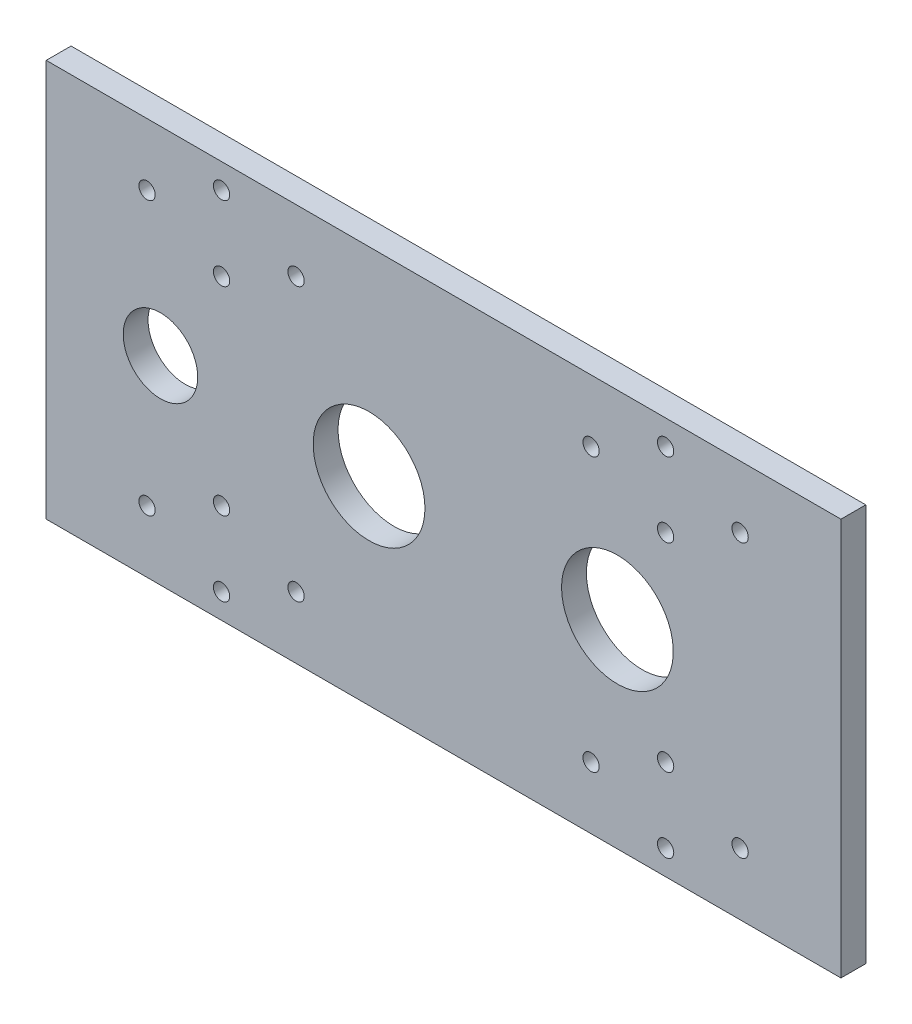
ISO-10303-21;
HEADER;
FILE_DESCRIPTION(('STEP AP214'),'2;1');
FILE_NAME('part.step','',(''),(''),'','','');
FILE_SCHEMA(('AUTOMOTIVE_DESIGN { 1 0 10303 214 1 1 1 1 }'));
ENDSEC;
DATA;
#1=APPLICATION_CONTEXT('core data for automotive mechanical design processes');
#2=APPLICATION_PROTOCOL_DEFINITION('international standard','automotive_design',2000,#1);
#3=PRODUCT_CONTEXT('',#1,'mechanical');
#4=PRODUCT('Part','Part','',(#3));
#5=PRODUCT_RELATED_PRODUCT_CATEGORY('part','',(#4));
#6=PRODUCT_DEFINITION_FORMATION('','',#4);
#7=PRODUCT_DEFINITION_CONTEXT('part definition',#1,'design');
#8=PRODUCT_DEFINITION('design','',#6,#7);
#9=PRODUCT_DEFINITION_SHAPE('','',#8);
#10=(LENGTH_UNIT() NAMED_UNIT(*) SI_UNIT(.MILLI.,.METRE.));
#11=(NAMED_UNIT(*) PLANE_ANGLE_UNIT() SI_UNIT($,.RADIAN.));
#12=(NAMED_UNIT(*) SI_UNIT($,.STERADIAN.) SOLID_ANGLE_UNIT());
#13=UNCERTAINTY_MEASURE_WITH_UNIT(LENGTH_MEASURE(1.E-05),#10,'distance_accuracy_value','');
#14=(GEOMETRIC_REPRESENTATION_CONTEXT(3) GLOBAL_UNCERTAINTY_ASSIGNED_CONTEXT((#13)) GLOBAL_UNIT_ASSIGNED_CONTEXT((#10,
#11,#12)) REPRESENTATION_CONTEXT('',''));
#15=CARTESIAN_POINT('',(0.,0.,0.));
#16=DIRECTION('',(0.,0.,1.));
#17=DIRECTION('',(1.,0.,0.));
#18=AXIS2_PLACEMENT_3D('',#15,#16,#17);
#19=CARTESIAN_POINT('',(0.,0.,6.35));
#20=DIRECTION('',(1.,0.,0.));
#21=DIRECTION('',(0.,0.,-1.));
#22=AXIS2_PLACEMENT_3D('',#19,#20,#21);
#23=PLANE('',#22);
#24=DIRECTION('',(0.,-1.,0.));
#25=VECTOR('',#24,1.);
#26=CARTESIAN_POINT('',(0.,0.,0.));
#27=LINE('',#26,#25);
#28=CARTESIAN_POINT('',(0.,101.6,0.));
#29=VERTEX_POINT('',#28);
#30=CARTESIAN_POINT('',(0.,0.,0.));
#31=VERTEX_POINT('',#30);
#32=EDGE_CURVE('E107',#29,#31,#27,.T.);
#33=ORIENTED_EDGE('',*,*,#32,.T.);
#34=DIRECTION('',(0.,0.,-1.));
#35=VECTOR('',#34,1.);
#36=CARTESIAN_POINT('',(0.,0.,6.35));
#37=LINE('',#36,#35);
#38=CARTESIAN_POINT('',(0.,0.,6.35));
#39=VERTEX_POINT('',#38);
#40=EDGE_CURVE('E11',#39,#31,#37,.T.);
#41=ORIENTED_EDGE('',*,*,#40,.F.);
#42=DIRECTION('',(0.,-1.,0.));
#43=VECTOR('',#42,1.);
#44=CARTESIAN_POINT('',(0.,0.,6.35));
#45=LINE('',#44,#43);
#46=CARTESIAN_POINT('',(0.,101.6,6.35));
#47=VERTEX_POINT('',#46);
#48=EDGE_CURVE('E91',#47,#39,#45,.T.);
#49=ORIENTED_EDGE('',*,*,#48,.F.);
#50=DIRECTION('',(0.,0.,-1.));
#51=VECTOR('',#50,1.);
#52=CARTESIAN_POINT('',(0.,101.6,6.35));
#53=LINE('',#52,#51);
#54=EDGE_CURVE('E103',#47,#29,#53,.T.);
#55=ORIENTED_EDGE('',*,*,#54,.T.);
#56=EDGE_LOOP('',(#33,#41,#49,#55));
#57=FACE_BOUND('',#56,.T.);
#58=ADVANCED_FACE('F39',(#57),#23,.F.);
#59=CARTESIAN_POINT('',(0.,0.,6.35));
#60=DIRECTION('',(0.,1.,0.));
#61=DIRECTION('',(0.,0.,1.));
#62=AXIS2_PLACEMENT_3D('',#59,#60,#61);
#63=PLANE('',#62);
#64=DIRECTION('',(1.,0.,0.));
#65=VECTOR('',#64,1.);
#66=CARTESIAN_POINT('',(0.,0.,0.));
#67=LINE('',#66,#65);
#68=CARTESIAN_POINT('',(203.2,0.,0.));
#69=VERTEX_POINT('',#68);
#70=EDGE_CURVE('E96',#31,#69,#67,.T.);
#71=ORIENTED_EDGE('',*,*,#70,.T.);
#72=DIRECTION('',(0.,0.,-1.));
#73=VECTOR('',#72,1.);
#74=CARTESIAN_POINT('',(203.2,0.,6.35));
#75=LINE('',#74,#73);
#76=CARTESIAN_POINT('',(203.2,0.,6.35));
#77=VERTEX_POINT('',#76);
#78=EDGE_CURVE('E48',#77,#69,#75,.T.);
#79=ORIENTED_EDGE('',*,*,#78,.F.);
#80=DIRECTION('',(1.,0.,0.));
#81=VECTOR('',#80,1.);
#82=CARTESIAN_POINT('',(0.,0.,6.35));
#83=LINE('',#82,#81);
#84=EDGE_CURVE('E86',#39,#77,#83,.T.);
#85=ORIENTED_EDGE('',*,*,#84,.F.);
#86=ORIENTED_EDGE('',*,*,#40,.T.);
#87=EDGE_LOOP('',(#71,#79,#85,#86));
#88=FACE_BOUND('',#87,.T.);
#89=ADVANCED_FACE('F95',(#88),#63,.F.);
#90=CARTESIAN_POINT('',(203.2,0.,6.35));
#91=DIRECTION('',(-1.,0.,0.));
#92=DIRECTION('',(0.,0.,1.));
#93=AXIS2_PLACEMENT_3D('',#90,#91,#92);
#94=PLANE('',#93);
#95=DIRECTION('',(0.,1.,0.));
#96=VECTOR('',#95,1.);
#97=CARTESIAN_POINT('',(203.2,0.,0.));
#98=LINE('',#97,#96);
#99=CARTESIAN_POINT('',(203.2,101.6,0.));
#100=VERTEX_POINT('',#99);
#101=EDGE_CURVE('E73',#69,#100,#98,.T.);
#102=ORIENTED_EDGE('',*,*,#101,.T.);
#103=DIRECTION('',(0.,0.,-1.));
#104=VECTOR('',#103,1.);
#105=CARTESIAN_POINT('',(203.2,101.6,6.35));
#106=LINE('',#105,#104);
#107=CARTESIAN_POINT('',(203.2,101.6,6.35));
#108=VERTEX_POINT('',#107);
#109=EDGE_CURVE('E98',#108,#100,#106,.T.);
#110=ORIENTED_EDGE('',*,*,#109,.F.);
#111=DIRECTION('',(0.,1.,0.));
#112=VECTOR('',#111,1.);
#113=CARTESIAN_POINT('',(203.2,0.,6.35));
#114=LINE('',#113,#112);
#115=EDGE_CURVE('E89',#77,#108,#114,.T.);
#116=ORIENTED_EDGE('',*,*,#115,.F.);
#117=ORIENTED_EDGE('',*,*,#78,.T.);
#118=EDGE_LOOP('',(#102,#110,#116,#117));
#119=FACE_BOUND('',#118,.T.);
#120=ADVANCED_FACE('F99',(#119),#94,.F.);
#121=CARTESIAN_POINT('',(0.,101.6,6.35));
#122=DIRECTION('',(0.,-1.,0.));
#123=DIRECTION('',(0.,0.,-1.));
#124=AXIS2_PLACEMENT_3D('',#121,#122,#123);
#125=PLANE('',#124);
#126=DIRECTION('',(-1.,0.,0.));
#127=VECTOR('',#126,1.);
#128=CARTESIAN_POINT('',(0.,101.6,0.));
#129=LINE('',#128,#127);
#130=EDGE_CURVE('E79',#100,#29,#129,.T.);
#131=ORIENTED_EDGE('',*,*,#130,.T.);
#132=ORIENTED_EDGE('',*,*,#54,.F.);
#133=DIRECTION('',(-1.,0.,0.));
#134=VECTOR('',#133,1.);
#135=CARTESIAN_POINT('',(0.,101.6,6.35));
#136=LINE('',#135,#134);
#137=EDGE_CURVE('E56',#108,#47,#136,.T.);
#138=ORIENTED_EDGE('',*,*,#137,.F.);
#139=ORIENTED_EDGE('',*,*,#109,.T.);
#140=EDGE_LOOP('',(#131,#132,#138,#139));
#141=FACE_BOUND('',#140,.T.);
#142=ADVANCED_FACE('F121',(#141),#125,.F.);
#143=CARTESIAN_POINT('',(0.,0.,6.35));
#144=DIRECTION('',(0.,0.,-1.));
#145=DIRECTION('',(-1.,0.,0.));
#146=AXIS2_PLACEMENT_3D('',#143,#144,#145);
#147=PLANE('',#146);
#148=CARTESIAN_POINT('',(63.881,85.725,6.35));
#149=DIRECTION('',(0.,0.,-1.));
#150=DIRECTION('',(-1.,0.,0.));
#151=AXIS2_PLACEMENT_3D('',#148,#149,#150);
#152=CIRCLE('',#151,2.08279999999999);
#153=CARTESIAN_POINT('',(61.7982,85.725,6.35));
#154=VERTEX_POINT('',#153);
#155=EDGE_CURVE('E272',#154,#154,#152,.T.);
#156=ORIENTED_EDGE('',*,*,#155,.T.);
#157=EDGE_LOOP('',(#156));
#158=FACE_BOUND('',#157,.T.);
#159=CARTESIAN_POINT('',(44.831,95.25,6.35));
#160=DIRECTION('',(0.,0.,-1.));
#161=DIRECTION('',(-1.,0.,0.));
#162=AXIS2_PLACEMENT_3D('',#159,#160,#161);
#163=CIRCLE('',#162,2.08279999999999);
#164=CARTESIAN_POINT('',(42.7482,95.25,6.35));
#165=VERTEX_POINT('',#164);
#166=EDGE_CURVE('E264',#165,#165,#163,.T.);
#167=ORIENTED_EDGE('',*,*,#166,.T.);
#168=EDGE_LOOP('',(#167));
#169=FACE_BOUND('',#168,.T.);
#170=CARTESIAN_POINT('',(44.831,76.2,6.35));
#171=DIRECTION('',(0.,0.,-1.));
#172=DIRECTION('',(-1.,0.,0.));
#173=AXIS2_PLACEMENT_3D('',#170,#171,#172);
#174=CIRCLE('',#173,2.08279999999999);
#175=CARTESIAN_POINT('',(42.7482,76.2,6.35));
#176=VERTEX_POINT('',#175);
#177=EDGE_CURVE('E256',#176,#176,#174,.T.);
#178=ORIENTED_EDGE('',*,*,#177,.T.);
#179=EDGE_LOOP('',(#178));
#180=FACE_BOUND('',#179,.T.);
#181=CARTESIAN_POINT('',(25.781,85.725,6.35));
#182=DIRECTION('',(0.,0.,-1.));
#183=DIRECTION('',(-1.,0.,0.));
#184=AXIS2_PLACEMENT_3D('',#181,#182,#183);
#185=CIRCLE('',#184,2.08280000000001);
#186=CARTESIAN_POINT('',(23.6982,85.725,6.35));
#187=VERTEX_POINT('',#186);
#188=EDGE_CURVE('E248',#187,#187,#185,.T.);
#189=ORIENTED_EDGE('',*,*,#188,.T.);
#190=EDGE_LOOP('',(#189));
#191=FACE_BOUND('',#190,.T.);
#192=CARTESIAN_POINT('',(63.881,15.875,6.35));
#193=DIRECTION('',(0.,0.,1.));
#194=DIRECTION('',(-1.,0.,0.));
#195=AXIS2_PLACEMENT_3D('',#192,#193,#194);
#196=CIRCLE('',#195,2.08279999999999);
#197=CARTESIAN_POINT('',(61.7982,15.875,6.35));
#198=VERTEX_POINT('',#197);
#199=EDGE_CURVE('E241',#198,#198,#196,.T.);
#200=ORIENTED_EDGE('',*,*,#199,.F.);
#201=EDGE_LOOP('',(#200));
#202=FACE_BOUND('',#201,.T.);
#203=CARTESIAN_POINT('',(44.831,6.34999999999999,6.35));
#204=DIRECTION('',(0.,0.,1.));
#205=DIRECTION('',(-1.,0.,0.));
#206=AXIS2_PLACEMENT_3D('',#203,#204,#205);
#207=CIRCLE('',#206,2.08279999999999);
#208=CARTESIAN_POINT('',(42.7482,6.34999999999999,6.35));
#209=VERTEX_POINT('',#208);
#210=EDGE_CURVE('E233',#209,#209,#207,.T.);
#211=ORIENTED_EDGE('',*,*,#210,.F.);
#212=EDGE_LOOP('',(#211));
#213=FACE_BOUND('',#212,.T.);
#214=CARTESIAN_POINT('',(44.831,25.4,6.35));
#215=DIRECTION('',(0.,0.,1.));
#216=DIRECTION('',(-1.,0.,0.));
#217=AXIS2_PLACEMENT_3D('',#214,#215,#216);
#218=CIRCLE('',#217,2.08279999999999);
#219=CARTESIAN_POINT('',(42.7482,25.4,6.35));
#220=VERTEX_POINT('',#219);
#221=EDGE_CURVE('E225',#220,#220,#218,.T.);
#222=ORIENTED_EDGE('',*,*,#221,.F.);
#223=EDGE_LOOP('',(#222));
#224=FACE_BOUND('',#223,.T.);
#225=CARTESIAN_POINT('',(25.781,15.875,6.35));
#226=DIRECTION('',(0.,0.,1.));
#227=DIRECTION('',(-1.,0.,0.));
#228=AXIS2_PLACEMENT_3D('',#225,#226,#227);
#229=CIRCLE('',#228,2.08280000000001);
#230=CARTESIAN_POINT('',(23.6982,15.875,6.35));
#231=VERTEX_POINT('',#230);
#232=EDGE_CURVE('E216',#231,#231,#229,.T.);
#233=ORIENTED_EDGE('',*,*,#232,.F.);
#234=EDGE_LOOP('',(#233));
#235=FACE_BOUND('',#234,.T.);
#236=CARTESIAN_POINT('',(139.319,15.875,6.35));
#237=DIRECTION('',(0.,0.,-1.));
#238=DIRECTION('',(1.,0.,0.));
#239=AXIS2_PLACEMENT_3D('',#236,#237,#238);
#240=CIRCLE('',#239,2.08279999999999);
#241=CARTESIAN_POINT('',(141.4018,15.875,6.35));
#242=VERTEX_POINT('',#241);
#243=EDGE_CURVE('E209',#242,#242,#240,.T.);
#244=ORIENTED_EDGE('',*,*,#243,.T.);
#245=EDGE_LOOP('',(#244));
#246=FACE_BOUND('',#245,.T.);
#247=CARTESIAN_POINT('',(158.369,6.34999999999999,6.35));
#248=DIRECTION('',(0.,0.,-1.));
#249=DIRECTION('',(1.,0.,0.));
#250=AXIS2_PLACEMENT_3D('',#247,#248,#249);
#251=CIRCLE('',#250,2.08279999999999);
#252=CARTESIAN_POINT('',(160.4518,6.34999999999999,6.35));
#253=VERTEX_POINT('',#252);
#254=EDGE_CURVE('E201',#253,#253,#251,.T.);
#255=ORIENTED_EDGE('',*,*,#254,.T.);
#256=EDGE_LOOP('',(#255));
#257=FACE_BOUND('',#256,.T.);
#258=CARTESIAN_POINT('',(158.369,25.4,6.35));
#259=DIRECTION('',(0.,0.,-1.));
#260=DIRECTION('',(1.,0.,0.));
#261=AXIS2_PLACEMENT_3D('',#258,#259,#260);
#262=CIRCLE('',#261,2.08279999999999);
#263=CARTESIAN_POINT('',(160.4518,25.4,6.35));
#264=VERTEX_POINT('',#263);
#265=EDGE_CURVE('E193',#264,#264,#262,.T.);
#266=ORIENTED_EDGE('',*,*,#265,.T.);
#267=EDGE_LOOP('',(#266));
#268=FACE_BOUND('',#267,.T.);
#269=CARTESIAN_POINT('',(177.419,15.875,6.35));
#270=DIRECTION('',(0.,0.,-1.));
#271=DIRECTION('',(1.,0.,0.));
#272=AXIS2_PLACEMENT_3D('',#269,#270,#271);
#273=CIRCLE('',#272,2.08280000000001);
#274=CARTESIAN_POINT('',(179.5018,15.875,6.35));
#275=VERTEX_POINT('',#274);
#276=EDGE_CURVE('E184',#275,#275,#273,.T.);
#277=ORIENTED_EDGE('',*,*,#276,.T.);
#278=EDGE_LOOP('',(#277));
#279=FACE_BOUND('',#278,.T.);
#280=CARTESIAN_POINT('',(139.319,85.725,6.35));
#281=DIRECTION('',(0.,0.,1.));
#282=DIRECTION('',(1.,0.,0.));
#283=AXIS2_PLACEMENT_3D('',#280,#281,#282);
#284=CIRCLE('',#283,2.08279999999999);
#285=CARTESIAN_POINT('',(141.4018,85.725,6.35));
#286=VERTEX_POINT('',#285);
#287=EDGE_CURVE('E177',#286,#286,#284,.T.);
#288=ORIENTED_EDGE('',*,*,#287,.F.);
#289=EDGE_LOOP('',(#288));
#290=FACE_BOUND('',#289,.T.);
#291=CARTESIAN_POINT('',(158.369,95.25,6.35));
#292=DIRECTION('',(0.,0.,1.));
#293=DIRECTION('',(1.,0.,0.));
#294=AXIS2_PLACEMENT_3D('',#291,#292,#293);
#295=CIRCLE('',#294,2.08279999999999);
#296=CARTESIAN_POINT('',(160.4518,95.25,6.35));
#297=VERTEX_POINT('',#296);
#298=EDGE_CURVE('E169',#297,#297,#295,.T.);
#299=ORIENTED_EDGE('',*,*,#298,.F.);
#300=EDGE_LOOP('',(#299));
#301=FACE_BOUND('',#300,.T.);
#302=CARTESIAN_POINT('',(158.369,76.2,6.35));
#303=DIRECTION('',(0.,0.,1.));
#304=DIRECTION('',(1.,0.,0.));
#305=AXIS2_PLACEMENT_3D('',#302,#303,#304);
#306=CIRCLE('',#305,2.08279999999999);
#307=CARTESIAN_POINT('',(160.4518,76.2,6.35));
#308=VERTEX_POINT('',#307);
#309=EDGE_CURVE('E161',#308,#308,#306,.T.);
#310=ORIENTED_EDGE('',*,*,#309,.F.);
#311=EDGE_LOOP('',(#310));
#312=FACE_BOUND('',#311,.T.);
#313=CARTESIAN_POINT('',(177.419,85.725,6.35));
#314=DIRECTION('',(0.,0.,1.));
#315=DIRECTION('',(1.,0.,0.));
#316=AXIS2_PLACEMENT_3D('',#313,#314,#315);
#317=CIRCLE('',#316,2.08280000000001);
#318=CARTESIAN_POINT('',(179.5018,85.725,6.35));
#319=VERTEX_POINT('',#318);
#320=EDGE_CURVE('E152',#319,#319,#317,.T.);
#321=ORIENTED_EDGE('',*,*,#320,.F.);
#322=EDGE_LOOP('',(#321));
#323=FACE_BOUND('',#322,.T.);
#324=CARTESIAN_POINT('',(29.21,50.8,6.35));
#325=DIRECTION('',(0.,0.,1.));
#326=DIRECTION('',(1.,0.,0.));
#327=AXIS2_PLACEMENT_3D('',#324,#325,#326);
#328=CIRCLE('',#327,9.52499999999999);
#329=CARTESIAN_POINT('',(38.735,50.8,6.35));
#330=VERTEX_POINT('',#329);
#331=EDGE_CURVE('E141',#330,#330,#328,.T.);
#332=ORIENTED_EDGE('',*,*,#331,.F.);
#333=EDGE_LOOP('',(#332));
#334=FACE_BOUND('',#333,.T.);
#335=CARTESIAN_POINT('',(146.05,50.8,6.35));
#336=DIRECTION('',(0.,0.,1.));
#337=DIRECTION('',(-1.,0.,0.));
#338=AXIS2_PLACEMENT_3D('',#335,#336,#337);
#339=CIRCLE('',#338,14.2875);
#340=CARTESIAN_POINT('',(131.7625,50.8,6.35));
#341=VERTEX_POINT('',#340);
#342=EDGE_CURVE('E140',#341,#341,#339,.T.);
#343=ORIENTED_EDGE('',*,*,#342,.F.);
#344=EDGE_LOOP('',(#343));
#345=FACE_BOUND('',#344,.T.);
#346=CARTESIAN_POINT('',(82.55,50.8,6.35));
#347=DIRECTION('',(0.,0.,1.));
#348=DIRECTION('',(1.,0.,0.));
#349=AXIS2_PLACEMENT_3D('',#346,#347,#348);
#350=CIRCLE('',#349,14.2875);
#351=CARTESIAN_POINT('',(96.8375,50.8,6.35));
#352=VERTEX_POINT('',#351);
#353=EDGE_CURVE('E131',#352,#352,#350,.T.);
#354=ORIENTED_EDGE('',*,*,#353,.F.);
#355=EDGE_LOOP('',(#354));
#356=FACE_BOUND('',#355,.T.);
#357=ORIENTED_EDGE('',*,*,#48,.T.);
#358=ORIENTED_EDGE('',*,*,#84,.T.);
#359=ORIENTED_EDGE('',*,*,#115,.T.);
#360=ORIENTED_EDGE('',*,*,#137,.T.);
#361=EDGE_LOOP('',(#357,#358,#359,#360));
#362=FACE_BOUND('',#361,.T.);
#363=ADVANCED_FACE('F87',(#158,#169,#180,#191,#202,#213,#224,#235,#246,#257,#268,#279,#290,#301,
#312,#323,#334,#345,#356,#362),#147,.F.);
#364=CARTESIAN_POINT('',(0.,0.,0.));
#365=DIRECTION('',(0.,0.,-1.));
#366=DIRECTION('',(-1.,0.,0.));
#367=AXIS2_PLACEMENT_3D('',#364,#365,#366);
#368=PLANE('',#367);
#369=CARTESIAN_POINT('',(63.881,85.725,0.));
#370=DIRECTION('',(0.,0.,-1.));
#371=DIRECTION('',(-1.,0.,0.));
#372=AXIS2_PLACEMENT_3D('',#369,#370,#371);
#373=CIRCLE('',#372,2.08279999999999);
#374=CARTESIAN_POINT('',(61.7982,85.725,0.));
#375=VERTEX_POINT('',#374);
#376=EDGE_CURVE('E221',#375,#375,#373,.T.);
#377=ORIENTED_EDGE('',*,*,#376,.F.);
#378=EDGE_LOOP('',(#377));
#379=FACE_BOUND('',#378,.T.);
#380=CARTESIAN_POINT('',(44.831,95.25,0.));
#381=DIRECTION('',(0.,0.,-1.));
#382=DIRECTION('',(-1.,0.,0.));
#383=AXIS2_PLACEMENT_3D('',#380,#381,#382);
#384=CIRCLE('',#383,2.08279999999999);
#385=CARTESIAN_POINT('',(42.7482,95.25,0.));
#386=VERTEX_POINT('',#385);
#387=EDGE_CURVE('E268',#386,#386,#384,.T.);
#388=ORIENTED_EDGE('',*,*,#387,.F.);
#389=EDGE_LOOP('',(#388));
#390=FACE_BOUND('',#389,.T.);
#391=CARTESIAN_POINT('',(44.831,76.2,0.));
#392=DIRECTION('',(0.,0.,-1.));
#393=DIRECTION('',(-1.,0.,0.));
#394=AXIS2_PLACEMENT_3D('',#391,#392,#393);
#395=CIRCLE('',#394,2.08279999999999);
#396=CARTESIAN_POINT('',(42.7482,76.2,0.));
#397=VERTEX_POINT('',#396);
#398=EDGE_CURVE('E260',#397,#397,#395,.T.);
#399=ORIENTED_EDGE('',*,*,#398,.F.);
#400=EDGE_LOOP('',(#399));
#401=FACE_BOUND('',#400,.T.);
#402=CARTESIAN_POINT('',(25.781,85.725,0.));
#403=DIRECTION('',(0.,0.,-1.));
#404=DIRECTION('',(-1.,0.,0.));
#405=AXIS2_PLACEMENT_3D('',#402,#403,#404);
#406=CIRCLE('',#405,2.08280000000001);
#407=CARTESIAN_POINT('',(23.6982,85.725,0.));
#408=VERTEX_POINT('',#407);
#409=EDGE_CURVE('E252',#408,#408,#406,.T.);
#410=ORIENTED_EDGE('',*,*,#409,.F.);
#411=EDGE_LOOP('',(#410));
#412=FACE_BOUND('',#411,.T.);
#413=CARTESIAN_POINT('',(63.881,15.875,0.));
#414=DIRECTION('',(0.,0.,1.));
#415=DIRECTION('',(-1.,0.,0.));
#416=AXIS2_PLACEMENT_3D('',#413,#414,#415);
#417=CIRCLE('',#416,2.08279999999999);
#418=CARTESIAN_POINT('',(61.7982,15.875,0.));
#419=VERTEX_POINT('',#418);
#420=EDGE_CURVE('E189',#419,#419,#417,.T.);
#421=ORIENTED_EDGE('',*,*,#420,.T.);
#422=EDGE_LOOP('',(#421));
#423=FACE_BOUND('',#422,.T.);
#424=CARTESIAN_POINT('',(44.831,6.34999999999999,0.));
#425=DIRECTION('',(0.,0.,1.));
#426=DIRECTION('',(-1.,0.,0.));
#427=AXIS2_PLACEMENT_3D('',#424,#425,#426);
#428=CIRCLE('',#427,2.08279999999999);
#429=CARTESIAN_POINT('',(42.7482,6.34999999999999,0.));
#430=VERTEX_POINT('',#429);
#431=EDGE_CURVE('E237',#430,#430,#428,.T.);
#432=ORIENTED_EDGE('',*,*,#431,.T.);
#433=EDGE_LOOP('',(#432));
#434=FACE_BOUND('',#433,.T.);
#435=CARTESIAN_POINT('',(44.831,25.4,0.));
#436=DIRECTION('',(0.,0.,1.));
#437=DIRECTION('',(-1.,0.,0.));
#438=AXIS2_PLACEMENT_3D('',#435,#436,#437);
#439=CIRCLE('',#438,2.08279999999999);
#440=CARTESIAN_POINT('',(42.7482,25.4,0.));
#441=VERTEX_POINT('',#440);
#442=EDGE_CURVE('E229',#441,#441,#439,.T.);
#443=ORIENTED_EDGE('',*,*,#442,.T.);
#444=EDGE_LOOP('',(#443));
#445=FACE_BOUND('',#444,.T.);
#446=CARTESIAN_POINT('',(25.781,15.875,0.));
#447=DIRECTION('',(0.,0.,1.));
#448=DIRECTION('',(-1.,0.,0.));
#449=AXIS2_PLACEMENT_3D('',#446,#447,#448);
#450=CIRCLE('',#449,2.08280000000001);
#451=CARTESIAN_POINT('',(23.6982,15.875,0.));
#452=VERTEX_POINT('',#451);
#453=EDGE_CURVE('E220',#452,#452,#450,.T.);
#454=ORIENTED_EDGE('',*,*,#453,.T.);
#455=EDGE_LOOP('',(#454));
#456=FACE_BOUND('',#455,.T.);
#457=CARTESIAN_POINT('',(139.319,15.875,0.));
#458=DIRECTION('',(0.,0.,-1.));
#459=DIRECTION('',(1.,0.,0.));
#460=AXIS2_PLACEMENT_3D('',#457,#458,#459);
#461=CIRCLE('',#460,2.08279999999999);
#462=CARTESIAN_POINT('',(141.4018,15.875,0.));
#463=VERTEX_POINT('',#462);
#464=EDGE_CURVE('E157',#463,#463,#461,.T.);
#465=ORIENTED_EDGE('',*,*,#464,.F.);
#466=EDGE_LOOP('',(#465));
#467=FACE_BOUND('',#466,.T.);
#468=CARTESIAN_POINT('',(158.369,6.34999999999999,0.));
#469=DIRECTION('',(0.,0.,-1.));
#470=DIRECTION('',(1.,0.,0.));
#471=AXIS2_PLACEMENT_3D('',#468,#469,#470);
#472=CIRCLE('',#471,2.08279999999999);
#473=CARTESIAN_POINT('',(160.4518,6.34999999999999,0.));
#474=VERTEX_POINT('',#473);
#475=EDGE_CURVE('E205',#474,#474,#472,.T.);
#476=ORIENTED_EDGE('',*,*,#475,.F.);
#477=EDGE_LOOP('',(#476));
#478=FACE_BOUND('',#477,.T.);
#479=CARTESIAN_POINT('',(158.369,25.4,0.));
#480=DIRECTION('',(0.,0.,-1.));
#481=DIRECTION('',(1.,0.,0.));
#482=AXIS2_PLACEMENT_3D('',#479,#480,#481);
#483=CIRCLE('',#482,2.08279999999999);
#484=CARTESIAN_POINT('',(160.4518,25.4,0.));
#485=VERTEX_POINT('',#484);
#486=EDGE_CURVE('E197',#485,#485,#483,.T.);
#487=ORIENTED_EDGE('',*,*,#486,.F.);
#488=EDGE_LOOP('',(#487));
#489=FACE_BOUND('',#488,.T.);
#490=CARTESIAN_POINT('',(177.419,15.875,0.));
#491=DIRECTION('',(0.,0.,-1.));
#492=DIRECTION('',(1.,0.,0.));
#493=AXIS2_PLACEMENT_3D('',#490,#491,#492);
#494=CIRCLE('',#493,2.08280000000001);
#495=CARTESIAN_POINT('',(179.5018,15.875,0.));
#496=VERTEX_POINT('',#495);
#497=EDGE_CURVE('E188',#496,#496,#494,.T.);
#498=ORIENTED_EDGE('',*,*,#497,.F.);
#499=EDGE_LOOP('',(#498));
#500=FACE_BOUND('',#499,.T.);
#501=CARTESIAN_POINT('',(139.319,85.725,0.));
#502=DIRECTION('',(0.,0.,1.));
#503=DIRECTION('',(1.,0.,0.));
#504=AXIS2_PLACEMENT_3D('',#501,#502,#503);
#505=CIRCLE('',#504,2.08279999999999);
#506=CARTESIAN_POINT('',(141.4018,85.725,0.));
#507=VERTEX_POINT('',#506);
#508=EDGE_CURVE('E145',#507,#507,#505,.T.);
#509=ORIENTED_EDGE('',*,*,#508,.T.);
#510=EDGE_LOOP('',(#509));
#511=FACE_BOUND('',#510,.T.);
#512=CARTESIAN_POINT('',(158.369,95.25,0.));
#513=DIRECTION('',(0.,0.,1.));
#514=DIRECTION('',(1.,0.,0.));
#515=AXIS2_PLACEMENT_3D('',#512,#513,#514);
#516=CIRCLE('',#515,2.08279999999999);
#517=CARTESIAN_POINT('',(160.4518,95.25,0.));
#518=VERTEX_POINT('',#517);
#519=EDGE_CURVE('E173',#518,#518,#516,.T.);
#520=ORIENTED_EDGE('',*,*,#519,.T.);
#521=EDGE_LOOP('',(#520));
#522=FACE_BOUND('',#521,.T.);
#523=CARTESIAN_POINT('',(158.369,76.2,0.));
#524=DIRECTION('',(0.,0.,1.));
#525=DIRECTION('',(1.,0.,0.));
#526=AXIS2_PLACEMENT_3D('',#523,#524,#525);
#527=CIRCLE('',#526,2.08279999999999);
#528=CARTESIAN_POINT('',(160.4518,76.2,0.));
#529=VERTEX_POINT('',#528);
#530=EDGE_CURVE('E165',#529,#529,#527,.T.);
#531=ORIENTED_EDGE('',*,*,#530,.T.);
#532=EDGE_LOOP('',(#531));
#533=FACE_BOUND('',#532,.T.);
#534=CARTESIAN_POINT('',(177.419,85.725,0.));
#535=DIRECTION('',(0.,0.,1.));
#536=DIRECTION('',(1.,0.,0.));
#537=AXIS2_PLACEMENT_3D('',#534,#535,#536);
#538=CIRCLE('',#537,2.08280000000001);
#539=CARTESIAN_POINT('',(179.5018,85.725,0.));
#540=VERTEX_POINT('',#539);
#541=EDGE_CURVE('E156',#540,#540,#538,.T.);
#542=ORIENTED_EDGE('',*,*,#541,.T.);
#543=EDGE_LOOP('',(#542));
#544=FACE_BOUND('',#543,.T.);
#545=CARTESIAN_POINT('',(29.21,50.8,0.));
#546=DIRECTION('',(0.,0.,-1.));
#547=DIRECTION('',(-1.,0.,0.));
#548=AXIS2_PLACEMENT_3D('',#545,#546,#547);
#549=CIRCLE('',#548,9.52499999999999);
#550=CARTESIAN_POINT('',(19.685,50.8,0.));
#551=VERTEX_POINT('',#550);
#552=EDGE_CURVE('E136',#551,#551,#549,.F.);
#553=ORIENTED_EDGE('',*,*,#552,.T.);
#554=EDGE_LOOP('',(#553));
#555=FACE_BOUND('',#554,.T.);
#556=CARTESIAN_POINT('',(146.05,50.8,0.));
#557=DIRECTION('',(0.,0.,-1.));
#558=DIRECTION('',(-1.,0.,0.));
#559=AXIS2_PLACEMENT_3D('',#556,#557,#558);
#560=CIRCLE('',#559,14.2875);
#561=CARTESIAN_POINT('',(131.7625,50.8,0.));
#562=VERTEX_POINT('',#561);
#563=EDGE_CURVE('E135',#562,#562,#560,.F.);
#564=ORIENTED_EDGE('',*,*,#563,.T.);
#565=EDGE_LOOP('',(#564));
#566=FACE_BOUND('',#565,.T.);
#567=CARTESIAN_POINT('',(82.55,50.8,0.));
#568=DIRECTION('',(0.,0.,-1.));
#569=DIRECTION('',(-1.,0.,0.));
#570=AXIS2_PLACEMENT_3D('',#567,#568,#569);
#571=CIRCLE('',#570,14.2875);
#572=CARTESIAN_POINT('',(68.2625,50.8,0.));
#573=VERTEX_POINT('',#572);
#574=EDGE_CURVE('E111',#573,#573,#571,.F.);
#575=ORIENTED_EDGE('',*,*,#574,.T.);
#576=EDGE_LOOP('',(#575));
#577=FACE_BOUND('',#576,.T.);
#578=ORIENTED_EDGE('',*,*,#32,.F.);
#579=ORIENTED_EDGE('',*,*,#130,.F.);
#580=ORIENTED_EDGE('',*,*,#101,.F.);
#581=ORIENTED_EDGE('',*,*,#70,.F.);
#582=EDGE_LOOP('',(#578,#579,#580,#581));
#583=FACE_BOUND('',#582,.T.);
#584=ADVANCED_FACE('F124',(#379,#390,#401,#412,#423,#434,#445,#456,#467,#478,#489,#500,#511,
#522,#533,#544,#555,#566,#577,#583),#368,.T.);
#585=CARTESIAN_POINT('',(82.55,50.8,-40.4111525448112));
#586=DIRECTION('',(0.,0.,1.));
#587=DIRECTION('',(1.,0.,0.));
#588=AXIS2_PLACEMENT_3D('',#585,#586,#587);
#589=CYLINDRICAL_SURFACE('',#588,14.2875);
#590=ORIENTED_EDGE('',*,*,#353,.T.);
#591=EDGE_LOOP('',(#590));
#592=FACE_BOUND('',#591,.T.);
#593=ORIENTED_EDGE('',*,*,#574,.F.);
#594=EDGE_LOOP('',(#593));
#595=FACE_BOUND('',#594,.T.);
#596=ADVANCED_FACE('F285',(#592,#595),#589,.F.);
#597=CARTESIAN_POINT('',(146.05,50.8,-40.4111525448112));
#598=DIRECTION('',(0.,0.,1.));
#599=DIRECTION('',(1.,0.,0.));
#600=AXIS2_PLACEMENT_3D('',#597,#598,#599);
#601=CYLINDRICAL_SURFACE('',#600,14.2875);
#602=ORIENTED_EDGE('',*,*,#342,.T.);
#603=EDGE_LOOP('',(#602));
#604=FACE_BOUND('',#603,.T.);
#605=ORIENTED_EDGE('',*,*,#563,.F.);
#606=EDGE_LOOP('',(#605));
#607=FACE_BOUND('',#606,.T.);
#608=ADVANCED_FACE('F324',(#604,#607),#601,.F.);
#609=CARTESIAN_POINT('',(29.21,50.8,-40.4111525448112));
#610=DIRECTION('',(0.,0.,1.));
#611=DIRECTION('',(1.,0.,0.));
#612=AXIS2_PLACEMENT_3D('',#609,#610,#611);
#613=CYLINDRICAL_SURFACE('',#612,9.52499999999999);
#614=ORIENTED_EDGE('',*,*,#331,.T.);
#615=EDGE_LOOP('',(#614));
#616=FACE_BOUND('',#615,.T.);
#617=ORIENTED_EDGE('',*,*,#552,.F.);
#618=EDGE_LOOP('',(#617));
#619=FACE_BOUND('',#618,.T.);
#620=ADVANCED_FACE('F330',(#616,#619),#613,.F.);
#621=CARTESIAN_POINT('',(177.419,85.725,0.));
#622=DIRECTION('',(0.,0.,1.));
#623=DIRECTION('',(1.,0.,0.));
#624=AXIS2_PLACEMENT_3D('',#621,#622,#623);
#625=CYLINDRICAL_SURFACE('',#624,2.08280000000001);
#626=ORIENTED_EDGE('',*,*,#541,.F.);
#627=EDGE_LOOP('',(#626));
#628=FACE_BOUND('',#627,.T.);
#629=ORIENTED_EDGE('',*,*,#320,.T.);
#630=EDGE_LOOP('',(#629));
#631=FACE_BOUND('',#630,.T.);
#632=ADVANCED_FACE('F390',(#628,#631),#625,.F.);
#633=CARTESIAN_POINT('',(158.369,76.2,0.));
#634=DIRECTION('',(0.,0.,1.));
#635=DIRECTION('',(1.,0.,0.));
#636=AXIS2_PLACEMENT_3D('',#633,#634,#635);
#637=CYLINDRICAL_SURFACE('',#636,2.08279999999999);
#638=ORIENTED_EDGE('',*,*,#530,.F.);
#639=EDGE_LOOP('',(#638));
#640=FACE_BOUND('',#639,.T.);
#641=ORIENTED_EDGE('',*,*,#309,.T.);
#642=EDGE_LOOP('',(#641));
#643=FACE_BOUND('',#642,.T.);
#644=ADVANCED_FACE('F394',(#640,#643),#637,.F.);
#645=CARTESIAN_POINT('',(158.369,95.25,0.));
#646=DIRECTION('',(0.,0.,1.));
#647=DIRECTION('',(1.,0.,0.));
#648=AXIS2_PLACEMENT_3D('',#645,#646,#647);
#649=CYLINDRICAL_SURFACE('',#648,2.08279999999999);
#650=ORIENTED_EDGE('',*,*,#519,.F.);
#651=EDGE_LOOP('',(#650));
#652=FACE_BOUND('',#651,.T.);
#653=ORIENTED_EDGE('',*,*,#298,.T.);
#654=EDGE_LOOP('',(#653));
#655=FACE_BOUND('',#654,.T.);
#656=ADVANCED_FACE('F400',(#652,#655),#649,.F.);
#657=CARTESIAN_POINT('',(139.319,85.725,0.));
#658=DIRECTION('',(0.,0.,1.));
#659=DIRECTION('',(1.,0.,0.));
#660=AXIS2_PLACEMENT_3D('',#657,#658,#659);
#661=CYLINDRICAL_SURFACE('',#660,2.08279999999999);
#662=ORIENTED_EDGE('',*,*,#508,.F.);
#663=EDGE_LOOP('',(#662));
#664=FACE_BOUND('',#663,.T.);
#665=ORIENTED_EDGE('',*,*,#287,.T.);
#666=EDGE_LOOP('',(#665));
#667=FACE_BOUND('',#666,.T.);
#668=ADVANCED_FACE('F404',(#664,#667),#661,.F.);
#669=CARTESIAN_POINT('',(177.419,15.875,0.));
#670=DIRECTION('',(0.,0.,1.));
#671=DIRECTION('',(1.,0.,0.));
#672=AXIS2_PLACEMENT_3D('',#669,#670,#671);
#673=CYLINDRICAL_SURFACE('',#672,2.08280000000001);
#674=ORIENTED_EDGE('',*,*,#497,.T.);
#675=EDGE_LOOP('',(#674));
#676=FACE_BOUND('',#675,.T.);
#677=ORIENTED_EDGE('',*,*,#276,.F.);
#678=EDGE_LOOP('',(#677));
#679=FACE_BOUND('',#678,.T.);
#680=ADVANCED_FACE('F408',(#676,#679),#673,.F.);
#681=CARTESIAN_POINT('',(158.369,25.4,0.));
#682=DIRECTION('',(0.,0.,1.));
#683=DIRECTION('',(1.,0.,0.));
#684=AXIS2_PLACEMENT_3D('',#681,#682,#683);
#685=CYLINDRICAL_SURFACE('',#684,2.08279999999999);
#686=ORIENTED_EDGE('',*,*,#486,.T.);
#687=EDGE_LOOP('',(#686));
#688=FACE_BOUND('',#687,.T.);
#689=ORIENTED_EDGE('',*,*,#265,.F.);
#690=EDGE_LOOP('',(#689));
#691=FACE_BOUND('',#690,.T.);
#692=ADVANCED_FACE('F412',(#688,#691),#685,.F.);
#693=CARTESIAN_POINT('',(158.369,6.34999999999999,0.));
#694=DIRECTION('',(0.,0.,1.));
#695=DIRECTION('',(1.,0.,0.));
#696=AXIS2_PLACEMENT_3D('',#693,#694,#695);
#697=CYLINDRICAL_SURFACE('',#696,2.08279999999999);
#698=ORIENTED_EDGE('',*,*,#475,.T.);
#699=EDGE_LOOP('',(#698));
#700=FACE_BOUND('',#699,.T.);
#701=ORIENTED_EDGE('',*,*,#254,.F.);
#702=EDGE_LOOP('',(#701));
#703=FACE_BOUND('',#702,.T.);
#704=ADVANCED_FACE('F416',(#700,#703),#697,.F.);
#705=CARTESIAN_POINT('',(139.319,15.875,0.));
#706=DIRECTION('',(0.,0.,1.));
#707=DIRECTION('',(1.,0.,0.));
#708=AXIS2_PLACEMENT_3D('',#705,#706,#707);
#709=CYLINDRICAL_SURFACE('',#708,2.08279999999999);
#710=ORIENTED_EDGE('',*,*,#464,.T.);
#711=EDGE_LOOP('',(#710));
#712=FACE_BOUND('',#711,.T.);
#713=ORIENTED_EDGE('',*,*,#243,.F.);
#714=EDGE_LOOP('',(#713));
#715=FACE_BOUND('',#714,.T.);
#716=ADVANCED_FACE('F420',(#712,#715),#709,.F.);
#717=CARTESIAN_POINT('',(25.781,15.875,0.));
#718=DIRECTION('',(0.,0.,1.));
#719=DIRECTION('',(1.,0.,0.));
#720=AXIS2_PLACEMENT_3D('',#717,#718,#719);
#721=CYLINDRICAL_SURFACE('',#720,2.08280000000001);
#722=ORIENTED_EDGE('',*,*,#453,.F.);
#723=EDGE_LOOP('',(#722));
#724=FACE_BOUND('',#723,.T.);
#725=ORIENTED_EDGE('',*,*,#232,.T.);
#726=EDGE_LOOP('',(#725));
#727=FACE_BOUND('',#726,.T.);
#728=ADVANCED_FACE('F424',(#724,#727),#721,.F.);
#729=CARTESIAN_POINT('',(44.831,25.4,0.));
#730=DIRECTION('',(0.,0.,1.));
#731=DIRECTION('',(1.,0.,0.));
#732=AXIS2_PLACEMENT_3D('',#729,#730,#731);
#733=CYLINDRICAL_SURFACE('',#732,2.08279999999999);
#734=ORIENTED_EDGE('',*,*,#442,.F.);
#735=EDGE_LOOP('',(#734));
#736=FACE_BOUND('',#735,.T.);
#737=ORIENTED_EDGE('',*,*,#221,.T.);
#738=EDGE_LOOP('',(#737));
#739=FACE_BOUND('',#738,.T.);
#740=ADVANCED_FACE('F428',(#736,#739),#733,.F.);
#741=CARTESIAN_POINT('',(44.831,6.34999999999999,0.));
#742=DIRECTION('',(0.,0.,1.));
#743=DIRECTION('',(1.,0.,0.));
#744=AXIS2_PLACEMENT_3D('',#741,#742,#743);
#745=CYLINDRICAL_SURFACE('',#744,2.08279999999999);
#746=ORIENTED_EDGE('',*,*,#431,.F.);
#747=EDGE_LOOP('',(#746));
#748=FACE_BOUND('',#747,.T.);
#749=ORIENTED_EDGE('',*,*,#210,.T.);
#750=EDGE_LOOP('',(#749));
#751=FACE_BOUND('',#750,.T.);
#752=ADVANCED_FACE('F432',(#748,#751),#745,.F.);
#753=CARTESIAN_POINT('',(63.881,15.875,0.));
#754=DIRECTION('',(0.,0.,1.));
#755=DIRECTION('',(1.,0.,0.));
#756=AXIS2_PLACEMENT_3D('',#753,#754,#755);
#757=CYLINDRICAL_SURFACE('',#756,2.08279999999999);
#758=ORIENTED_EDGE('',*,*,#420,.F.);
#759=EDGE_LOOP('',(#758));
#760=FACE_BOUND('',#759,.T.);
#761=ORIENTED_EDGE('',*,*,#199,.T.);
#762=EDGE_LOOP('',(#761));
#763=FACE_BOUND('',#762,.T.);
#764=ADVANCED_FACE('F436',(#760,#763),#757,.F.);
#765=CARTESIAN_POINT('',(25.781,85.725,0.));
#766=DIRECTION('',(0.,0.,1.));
#767=DIRECTION('',(1.,0.,0.));
#768=AXIS2_PLACEMENT_3D('',#765,#766,#767);
#769=CYLINDRICAL_SURFACE('',#768,2.08280000000001);
#770=ORIENTED_EDGE('',*,*,#409,.T.);
#771=EDGE_LOOP('',(#770));
#772=FACE_BOUND('',#771,.T.);
#773=ORIENTED_EDGE('',*,*,#188,.F.);
#774=EDGE_LOOP('',(#773));
#775=FACE_BOUND('',#774,.T.);
#776=ADVANCED_FACE('F440',(#772,#775),#769,.F.);
#777=CARTESIAN_POINT('',(44.831,76.2,0.));
#778=DIRECTION('',(0.,0.,1.));
#779=DIRECTION('',(1.,0.,0.));
#780=AXIS2_PLACEMENT_3D('',#777,#778,#779);
#781=CYLINDRICAL_SURFACE('',#780,2.08279999999999);
#782=ORIENTED_EDGE('',*,*,#398,.T.);
#783=EDGE_LOOP('',(#782));
#784=FACE_BOUND('',#783,.T.);
#785=ORIENTED_EDGE('',*,*,#177,.F.);
#786=EDGE_LOOP('',(#785));
#787=FACE_BOUND('',#786,.T.);
#788=ADVANCED_FACE('F444',(#784,#787),#781,.F.);
#789=CARTESIAN_POINT('',(44.831,95.25,0.));
#790=DIRECTION('',(0.,0.,1.));
#791=DIRECTION('',(1.,0.,0.));
#792=AXIS2_PLACEMENT_3D('',#789,#790,#791);
#793=CYLINDRICAL_SURFACE('',#792,2.08279999999999);
#794=ORIENTED_EDGE('',*,*,#387,.T.);
#795=EDGE_LOOP('',(#794));
#796=FACE_BOUND('',#795,.T.);
#797=ORIENTED_EDGE('',*,*,#166,.F.);
#798=EDGE_LOOP('',(#797));
#799=FACE_BOUND('',#798,.T.);
#800=ADVANCED_FACE('F448',(#796,#799),#793,.F.);
#801=CARTESIAN_POINT('',(63.881,85.725,0.));
#802=DIRECTION('',(0.,0.,1.));
#803=DIRECTION('',(1.,0.,0.));
#804=AXIS2_PLACEMENT_3D('',#801,#802,#803);
#805=CYLINDRICAL_SURFACE('',#804,2.08279999999999);
#806=ORIENTED_EDGE('',*,*,#376,.T.);
#807=EDGE_LOOP('',(#806));
#808=FACE_BOUND('',#807,.T.);
#809=ORIENTED_EDGE('',*,*,#155,.F.);
#810=EDGE_LOOP('',(#809));
#811=FACE_BOUND('',#810,.T.);
#812=ADVANCED_FACE('F280',(#808,#811),#805,.F.);
#813=CLOSED_SHELL('',(#58,#89,#120,#142,#363,#584,#596,#608,#620,#632,#644,#656,#668,#680,#692,
#704,#716,#728,#740,#752,#764,#776,#788,#800,#812));
#814=MANIFOLD_SOLID_BREP('B2',#813);
#815=ADVANCED_BREP_SHAPE_REPRESENTATION('',(#18,#814),#14);
#816=SHAPE_DEFINITION_REPRESENTATION(#9,#815);
ENDSEC;
END-ISO-10303-21;
